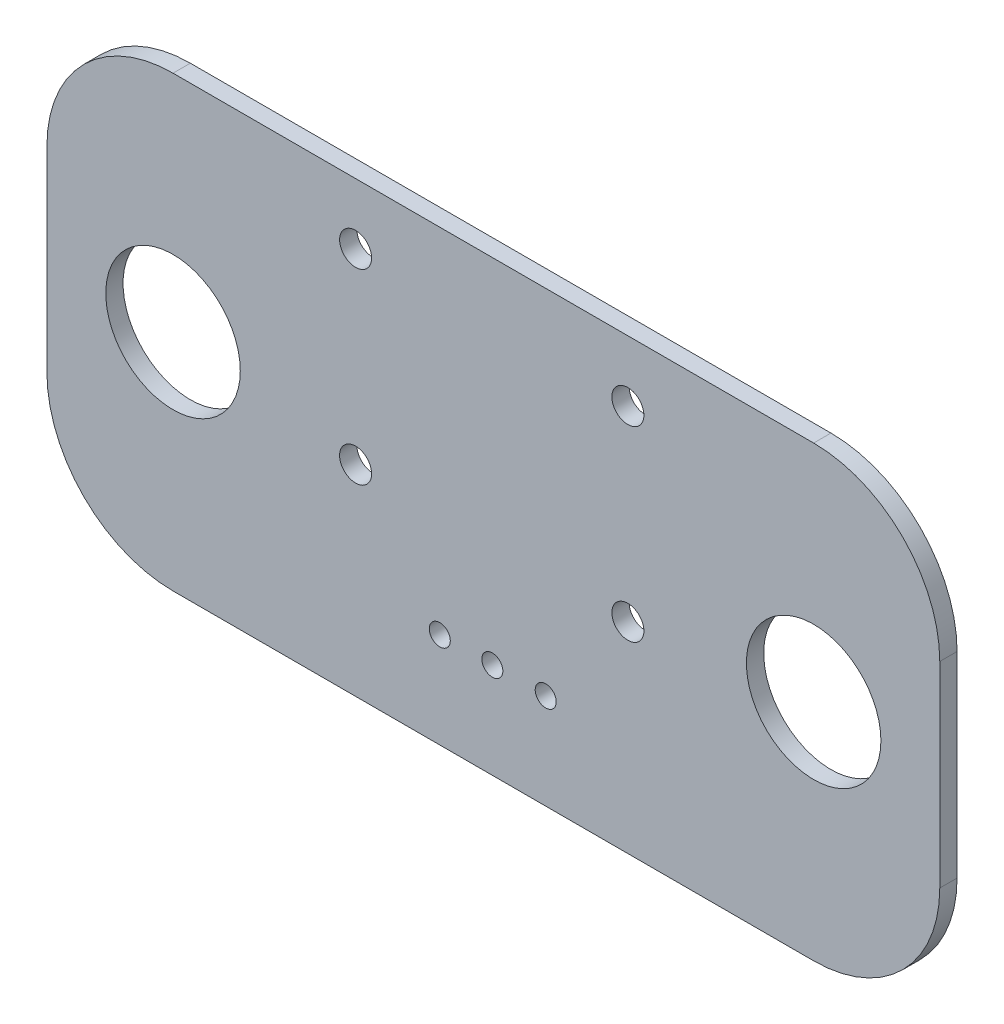
ISO-10303-21;
HEADER;
FILE_DESCRIPTION(('STEP AP214'),'2;1');
FILE_NAME('part.step','',(''),(''),'','','');
FILE_SCHEMA(('AUTOMOTIVE_DESIGN { 1 0 10303 214 1 1 1 1 }'));
ENDSEC;
DATA;
#1=APPLICATION_CONTEXT('core data for automotive mechanical design processes');
#2=APPLICATION_PROTOCOL_DEFINITION('international standard','automotive_design',2000,#1);
#3=PRODUCT_CONTEXT('',#1,'mechanical');
#4=PRODUCT('Part','Part','',(#3));
#5=PRODUCT_RELATED_PRODUCT_CATEGORY('part','',(#4));
#6=PRODUCT_DEFINITION_FORMATION('','',#4);
#7=PRODUCT_DEFINITION_CONTEXT('part definition',#1,'design');
#8=PRODUCT_DEFINITION('design','',#6,#7);
#9=PRODUCT_DEFINITION_SHAPE('','',#8);
#10=(LENGTH_UNIT() NAMED_UNIT(*) SI_UNIT(.MILLI.,.METRE.));
#11=(NAMED_UNIT(*) PLANE_ANGLE_UNIT() SI_UNIT($,.RADIAN.));
#12=(NAMED_UNIT(*) SI_UNIT($,.STERADIAN.) SOLID_ANGLE_UNIT());
#13=UNCERTAINTY_MEASURE_WITH_UNIT(LENGTH_MEASURE(1.E-05),#10,'distance_accuracy_value','');
#14=(GEOMETRIC_REPRESENTATION_CONTEXT(3) GLOBAL_UNCERTAINTY_ASSIGNED_CONTEXT((#13)) GLOBAL_UNIT_ASSIGNED_CONTEXT((#10,
#11,#12)) REPRESENTATION_CONTEXT('',''));
#15=CARTESIAN_POINT('',(0.,0.,0.));
#16=DIRECTION('',(0.,0.,1.));
#17=DIRECTION('',(1.,0.,0.));
#18=AXIS2_PLACEMENT_3D('',#15,#16,#17);
#19=CARTESIAN_POINT('',(37.840912359576,52.332087976117,-0.41148));
#20=DIRECTION('',(0.,0.,-1.));
#21=DIRECTION('',(0.00036210027185349,-0.999999934441694,0.));
#22=AXIS2_PLACEMENT_3D('',#19,#20,#21);
#23=CYLINDRICAL_SURFACE('',#22,3.001086891125);
#24=CARTESIAN_POINT('',(37.840912359576,52.332087976117,-0.41148));
#25=DIRECTION('',(0.,0.,1.));
#26=DIRECTION('',(0.00036210027185349,-0.999999934441694,0.));
#27=AXIS2_PLACEMENT_3D('',#24,#25,#26);
#28=CIRCLE('',#27,3.001086891125);
#29=CARTESIAN_POINT('',(37.841999053955,49.331001281738,-0.41148));
#30=VERTEX_POINT('',#29);
#31=CARTESIAN_POINT('',(40.841999053955,52.331001281738,-0.41148));
#32=VERTEX_POINT('',#31);
#33=EDGE_CURVE('E48',#30,#32,#28,.T.);
#34=ORIENTED_EDGE('',*,*,#33,.T.);
#35=DIRECTION('',(0.,0.,1.));
#36=VECTOR('',#35,1.);
#37=CARTESIAN_POINT('',(40.841999053955,52.331001281738,-0.41148));
#38=LINE('',#37,#36);
#39=CARTESIAN_POINT('',(40.841999053955,52.331001281738,0.));
#40=VERTEX_POINT('',#39);
#41=EDGE_CURVE('E232',#32,#40,#38,.T.);
#42=ORIENTED_EDGE('',*,*,#41,.T.);
#43=CARTESIAN_POINT('',(37.840912359576,52.332087976117,0.));
#44=DIRECTION('',(0.,0.,1.));
#45=DIRECTION('',(0.00036210027185349,-0.999999934441694,0.));
#46=AXIS2_PLACEMENT_3D('',#43,#44,#45);
#47=CIRCLE('',#46,3.001086891125);
#48=CARTESIAN_POINT('',(37.841999053955,49.331001281738,0.));
#49=VERTEX_POINT('',#48);
#50=EDGE_CURVE('E218',#49,#40,#47,.T.);
#51=ORIENTED_EDGE('',*,*,#50,.F.);
#52=DIRECTION('',(0.,0.,1.));
#53=VECTOR('',#52,1.);
#54=CARTESIAN_POINT('',(37.841999053955,49.331001281738,-0.41148));
#55=LINE('',#54,#53);
#56=EDGE_CURVE('E11',#30,#49,#55,.T.);
#57=ORIENTED_EDGE('',*,*,#56,.F.);
#58=EDGE_LOOP('',(#34,#42,#51,#57));
#59=FACE_BOUND('',#58,.T.);
#60=ADVANCED_FACE('F38',(#59),#23,.T.);
#61=CARTESIAN_POINT('',(40.841999053955,52.331001281738,-0.41148));
#62=DIRECTION('',(-1.,0.,0.));
#63=DIRECTION('',(0.,0.,1.));
#64=AXIS2_PLACEMENT_3D('',#61,#62,#63);
#65=PLANE('',#64);
#66=DIRECTION('',(0.,1.,0.));
#67=VECTOR('',#66,1.);
#68=CARTESIAN_POINT('',(40.841999053955,52.331001281738,-0.41148));
#69=LINE('',#68,#67);
#70=CARTESIAN_POINT('',(40.841999053955,56.999000549316,-0.41148));
#71=VERTEX_POINT('',#70);
#72=EDGE_CURVE('E201',#32,#71,#69,.T.);
#73=ORIENTED_EDGE('',*,*,#72,.T.);
#74=DIRECTION('',(0.,0.,1.));
#75=VECTOR('',#74,1.);
#76=CARTESIAN_POINT('',(40.841999053955,56.999000549316,-0.41148));
#77=LINE('',#76,#75);
#78=CARTESIAN_POINT('',(40.841999053955,56.999000549316,0.));
#79=VERTEX_POINT('',#78);
#80=EDGE_CURVE('E198',#71,#79,#77,.T.);
#81=ORIENTED_EDGE('',*,*,#80,.T.);
#82=DIRECTION('',(0.,1.,0.));
#83=VECTOR('',#82,1.);
#84=CARTESIAN_POINT('',(40.841999053955,52.331001281738,0.));
#85=LINE('',#84,#83);
#86=EDGE_CURVE('E215',#40,#79,#85,.T.);
#87=ORIENTED_EDGE('',*,*,#86,.F.);
#88=ORIENTED_EDGE('',*,*,#41,.F.);
#89=EDGE_LOOP('',(#73,#81,#87,#88));
#90=FACE_BOUND('',#89,.T.);
#91=ADVANCED_FACE('F329',(#90),#65,.F.);
#92=CARTESIAN_POINT('',(37.840905841769,56.997907337131,-0.41148));
#93=DIRECTION('',(0.,0.,-1.));
#94=DIRECTION('',(0.999999933653209,0.000364271295750376,0.));
#95=AXIS2_PLACEMENT_3D('',#92,#93,#94);
#96=CYLINDRICAL_SURFACE('',#95,3.001093411299);
#97=CARTESIAN_POINT('',(37.840905841769,56.997907337131,-0.41148));
#98=DIRECTION('',(0.,0.,1.));
#99=DIRECTION('',(0.999999933653209,0.000364271295750376,0.));
#100=AXIS2_PLACEMENT_3D('',#97,#98,#99);
#101=CIRCLE('',#100,3.001093411299);
#102=CARTESIAN_POINT('',(37.841999053955,59.999000549316,-0.41148));
#103=VERTEX_POINT('',#102);
#104=EDGE_CURVE('E202',#71,#103,#101,.T.);
#105=ORIENTED_EDGE('',*,*,#104,.T.);
#106=DIRECTION('',(0.,0.,1.));
#107=VECTOR('',#106,1.);
#108=CARTESIAN_POINT('',(37.841999053955,59.999000549316,-0.41148));
#109=LINE('',#108,#107);
#110=CARTESIAN_POINT('',(37.841999053955,59.999000549316,0.));
#111=VERTEX_POINT('',#110);
#112=EDGE_CURVE('E183',#103,#111,#109,.T.);
#113=ORIENTED_EDGE('',*,*,#112,.T.);
#114=CARTESIAN_POINT('',(37.840905841769,56.997907337131,0.));
#115=DIRECTION('',(0.,0.,1.));
#116=DIRECTION('',(0.999999933653209,0.000364271295750376,0.));
#117=AXIS2_PLACEMENT_3D('',#114,#115,#116);
#118=CIRCLE('',#117,3.001093411299);
#119=EDGE_CURVE('E205',#79,#111,#118,.T.);
#120=ORIENTED_EDGE('',*,*,#119,.F.);
#121=ORIENTED_EDGE('',*,*,#80,.F.);
#122=EDGE_LOOP('',(#105,#113,#120,#121));
#123=FACE_BOUND('',#122,.T.);
#124=ADVANCED_FACE('F335',(#123),#96,.T.);
#125=CARTESIAN_POINT('',(37.841999053955,59.999000549316,-0.41148));
#126=DIRECTION('',(0.,-1.,0.));
#127=DIRECTION('',(0.,0.,-1.));
#128=AXIS2_PLACEMENT_3D('',#125,#126,#127);
#129=PLANE('',#128);
#130=DIRECTION('',(-1.,0.,0.));
#131=VECTOR('',#130,1.);
#132=CARTESIAN_POINT('',(37.841999053955,59.999000549316,-0.41148));
#133=LINE('',#132,#131);
#134=CARTESIAN_POINT('',(22.601999282837,59.999000549316,-0.41148));
#135=VERTEX_POINT('',#134);
#136=EDGE_CURVE('E180',#103,#135,#133,.T.);
#137=ORIENTED_EDGE('',*,*,#136,.T.);
#138=DIRECTION('',(0.,0.,1.));
#139=VECTOR('',#138,1.);
#140=CARTESIAN_POINT('',(22.601999282837,59.999000549316,-0.41148));
#141=LINE('',#140,#139);
#142=CARTESIAN_POINT('',(22.601999282837,59.999000549316,0.));
#143=VERTEX_POINT('',#142);
#144=EDGE_CURVE('E184',#135,#143,#141,.T.);
#145=ORIENTED_EDGE('',*,*,#144,.T.);
#146=DIRECTION('',(-1.,0.,0.));
#147=VECTOR('',#146,1.);
#148=CARTESIAN_POINT('',(37.841999053955,59.999000549316,0.));
#149=LINE('',#148,#147);
#150=EDGE_CURVE('E203',#111,#143,#149,.T.);
#151=ORIENTED_EDGE('',*,*,#150,.F.);
#152=ORIENTED_EDGE('',*,*,#112,.F.);
#153=EDGE_LOOP('',(#137,#145,#151,#152));
#154=FACE_BOUND('',#153,.T.);
#155=ADVANCED_FACE('F369',(#154),#129,.F.);
#156=CARTESIAN_POINT('',(22.601389310775,56.999610151806,-0.41148));
#157=DIRECTION('',(0.,0.,-1.));
#158=DIRECTION('',(0.000203365340446154,0.999999979321269,0.));
#159=AXIS2_PLACEMENT_3D('',#156,#157,#158);
#160=CYLINDRICAL_SURFACE('',#159,2.999390459534);
#161=CARTESIAN_POINT('',(22.601389310775,56.999610151806,-0.41148));
#162=DIRECTION('',(0.,0.,1.));
#163=DIRECTION('',(0.000203365340446154,0.999999979321269,0.));
#164=AXIS2_PLACEMENT_3D('',#161,#162,#163);
#165=CIRCLE('',#164,2.999390459534);
#166=CARTESIAN_POINT('',(19.601999282837,56.998001098633,-0.41148));
#167=VERTEX_POINT('',#166);
#168=EDGE_CURVE('E209',#135,#167,#165,.T.);
#169=ORIENTED_EDGE('',*,*,#168,.T.);
#170=DIRECTION('',(0.,0.,1.));
#171=VECTOR('',#170,1.);
#172=CARTESIAN_POINT('',(19.601999282837,56.998001098633,-0.41148));
#173=LINE('',#172,#171);
#174=CARTESIAN_POINT('',(19.601999282837,56.998001098633,0.));
#175=VERTEX_POINT('',#174);
#176=EDGE_CURVE('E245',#167,#175,#173,.T.);
#177=ORIENTED_EDGE('',*,*,#176,.T.);
#178=CARTESIAN_POINT('',(22.601389310775,56.999610151806,0.));
#179=DIRECTION('',(0.,0.,1.));
#180=DIRECTION('',(0.000203365340446154,0.999999979321269,0.));
#181=AXIS2_PLACEMENT_3D('',#178,#179,#180);
#182=CIRCLE('',#181,2.999390459534);
#183=EDGE_CURVE('E206',#143,#175,#182,.T.);
#184=ORIENTED_EDGE('',*,*,#183,.F.);
#185=ORIENTED_EDGE('',*,*,#144,.F.);
#186=EDGE_LOOP('',(#169,#177,#184,#185));
#187=FACE_BOUND('',#186,.T.);
#188=ADVANCED_FACE('F343',(#187),#160,.T.);
#189=CARTESIAN_POINT('',(19.601999282837,56.998001098633,-0.41148));
#190=DIRECTION('',(1.,0.,0.));
#191=DIRECTION('',(0.,1.,0.));
#192=AXIS2_PLACEMENT_3D('',#189,#190,#191);
#193=PLANE('',#192);
#194=DIRECTION('',(0.,-1.,0.));
#195=VECTOR('',#194,1.);
#196=CARTESIAN_POINT('',(19.601999282837,56.998001098633,-0.41148));
#197=LINE('',#196,#195);
#198=CARTESIAN_POINT('',(19.601999282837,52.331001281738,-0.41148));
#199=VERTEX_POINT('',#198);
#200=EDGE_CURVE('E248',#167,#199,#197,.T.);
#201=ORIENTED_EDGE('',*,*,#200,.T.);
#202=DIRECTION('',(0.,0.,1.));
#203=VECTOR('',#202,1.);
#204=CARTESIAN_POINT('',(19.601999282837,52.331001281738,-0.41148));
#205=LINE('',#204,#203);
#206=CARTESIAN_POINT('',(19.601999282837,52.331001281738,0.));
#207=VERTEX_POINT('',#206);
#208=EDGE_CURVE('E250',#199,#207,#205,.T.);
#209=ORIENTED_EDGE('',*,*,#208,.T.);
#210=DIRECTION('',(0.,-1.,0.));
#211=VECTOR('',#210,1.);
#212=CARTESIAN_POINT('',(19.601999282837,56.998001098633,0.));
#213=LINE('',#212,#211);
#214=EDGE_CURVE('E158',#175,#207,#213,.T.);
#215=ORIENTED_EDGE('',*,*,#214,.F.);
#216=ORIENTED_EDGE('',*,*,#176,.F.);
#217=EDGE_LOOP('',(#201,#209,#215,#216));
#218=FACE_BOUND('',#217,.T.);
#219=ADVANCED_FACE('F341',(#218),#193,.F.);
#220=CARTESIAN_POINT('',(22.601382542079,52.33038454098,-0.41148));
#221=DIRECTION('',(0.,0.,-1.));
#222=DIRECTION('',(-0.999999978859689,0.000205622520230636,0.));
#223=AXIS2_PLACEMENT_3D('',#220,#221,#222);
#224=CYLINDRICAL_SURFACE('',#223,2.99938332265);
#225=DIRECTION('',(0.,0.,1.));
#226=VECTOR('',#225,1.);
#227=CARTESIAN_POINT('',(22.601999282837,49.331001281738,-0.41148));
#228=LINE('',#227,#226);
#229=CARTESIAN_POINT('',(22.601999282837,49.331001281738,-0.41148));
#230=VERTEX_POINT('',#229);
#231=CARTESIAN_POINT('',(22.601999282837,49.331001281738,0.));
#232=VERTEX_POINT('',#231);
#233=EDGE_CURVE('E163',#230,#232,#228,.T.);
#234=ORIENTED_EDGE('',*,*,#233,.T.);
#235=CARTESIAN_POINT('',(22.601382542079,52.33038454098,0.));
#236=DIRECTION('',(0.,0.,1.));
#237=DIRECTION('',(-0.999999978859689,0.000205622520230636,0.));
#238=AXIS2_PLACEMENT_3D('',#235,#236,#237);
#239=CIRCLE('',#238,2.99938332265);
#240=EDGE_CURVE('E152',#207,#232,#239,.T.);
#241=ORIENTED_EDGE('',*,*,#240,.F.);
#242=ORIENTED_EDGE('',*,*,#208,.F.);
#243=CARTESIAN_POINT('',(22.601382542079,52.33038454098,-0.41148));
#244=DIRECTION('',(0.,0.,1.));
#245=DIRECTION('',(-0.999999978859689,0.000205622520230636,0.));
#246=AXIS2_PLACEMENT_3D('',#243,#244,#245);
#247=CIRCLE('',#246,2.99938332265);
#248=EDGE_CURVE('E166',#199,#230,#247,.T.);
#249=ORIENTED_EDGE('',*,*,#248,.T.);
#250=EDGE_LOOP('',(#234,#241,#242,#249));
#251=FACE_BOUND('',#250,.T.);
#252=ADVANCED_FACE('F164',(#251),#224,.T.);
#253=CARTESIAN_POINT('',(22.601999282837,49.331001281738,-0.41148));
#254=DIRECTION('',(0.,1.,0.));
#255=DIRECTION('',(1.,0.,0.));
#256=AXIS2_PLACEMENT_3D('',#253,#254,#255);
#257=PLANE('',#256);
#258=DIRECTION('',(1.,0.,0.));
#259=VECTOR('',#258,1.);
#260=CARTESIAN_POINT('',(22.601999282837,49.331001281738,-0.41148));
#261=LINE('',#260,#259);
#262=EDGE_CURVE('E170',#230,#30,#261,.T.);
#263=ORIENTED_EDGE('',*,*,#262,.T.);
#264=ORIENTED_EDGE('',*,*,#56,.T.);
#265=DIRECTION('',(1.,0.,0.));
#266=VECTOR('',#265,1.);
#267=CARTESIAN_POINT('',(22.601999282837,49.331001281738,0.));
#268=LINE('',#267,#266);
#269=EDGE_CURVE('E57',#232,#49,#268,.T.);
#270=ORIENTED_EDGE('',*,*,#269,.F.);
#271=ORIENTED_EDGE('',*,*,#233,.F.);
#272=EDGE_LOOP('',(#263,#264,#270,#271));
#273=FACE_BOUND('',#272,.T.);
#274=ADVANCED_FACE('F172',(#273),#257,.F.);
#275=CARTESIAN_POINT('',(22.601682,54.665118,-0.41148));
#276=DIRECTION('',(0.,0.,-1.));
#277=DIRECTION('',(1.,0.,0.));
#278=AXIS2_PLACEMENT_3D('',#275,#276,#277);
#279=CYLINDRICAL_SURFACE('',#278,1.59999934);
#280=DIRECTION('',(0.,0.,1.));
#281=VECTOR('',#280,1.);
#282=CARTESIAN_POINT('',(24.20168134,54.665118,-0.41148));
#283=LINE('',#282,#281);
#284=CARTESIAN_POINT('',(24.20168134,54.665118,-0.41148));
#285=VERTEX_POINT('',#284);
#286=CARTESIAN_POINT('',(24.20168134,54.665118,0.));
#287=VERTEX_POINT('',#286);
#288=EDGE_CURVE('E213',#285,#287,#283,.T.);
#289=ORIENTED_EDGE('',*,*,#288,.T.);
#290=CARTESIAN_POINT('',(22.601682,54.665118,0.));
#291=DIRECTION('',(0.,0.,1.));
#292=DIRECTION('',(1.,0.,0.));
#293=AXIS2_PLACEMENT_3D('',#290,#291,#292);
#294=CIRCLE('',#293,1.59999934);
#295=EDGE_CURVE('E210',#287,#287,#294,.T.);
#296=ORIENTED_EDGE('',*,*,#295,.T.);
#297=ORIENTED_EDGE('',*,*,#288,.F.);
#298=CARTESIAN_POINT('',(22.601682,54.665118,-0.41148));
#299=DIRECTION('',(0.,0.,1.));
#300=DIRECTION('',(1.,0.,0.));
#301=AXIS2_PLACEMENT_3D('',#298,#299,#300);
#302=CIRCLE('',#301,1.59999934);
#303=EDGE_CURVE('E241',#285,#285,#302,.T.);
#304=ORIENTED_EDGE('',*,*,#303,.F.);
#305=EDGE_LOOP('',(#289,#296,#297,#304));
#306=FACE_BOUND('',#305,.T.);
#307=ADVANCED_FACE('F304',(#306),#279,.F.);
#308=CARTESIAN_POINT('',(26.945082,54.106318,-0.41148));
#309=DIRECTION('',(0.,0.,-1.));
#310=DIRECTION('',(1.,0.,0.));
#311=AXIS2_PLACEMENT_3D('',#308,#309,#310);
#312=CYLINDRICAL_SURFACE('',#311,0.381);
#313=DIRECTION('',(0.,0.,1.));
#314=VECTOR('',#313,1.);
#315=CARTESIAN_POINT('',(27.326082,54.106318,-0.41148));
#316=LINE('',#315,#314);
#317=CARTESIAN_POINT('',(27.326082,54.106318,-0.41148));
#318=VERTEX_POINT('',#317);
#319=CARTESIAN_POINT('',(27.326082,54.106318,0.));
#320=VERTEX_POINT('',#319);
#321=EDGE_CURVE('E214',#318,#320,#316,.T.);
#322=ORIENTED_EDGE('',*,*,#321,.T.);
#323=CARTESIAN_POINT('',(26.945082,54.106318,0.));
#324=DIRECTION('',(0.,0.,1.));
#325=DIRECTION('',(1.,0.,0.));
#326=AXIS2_PLACEMENT_3D('',#323,#324,#325);
#327=CIRCLE('',#326,0.381);
#328=EDGE_CURVE('E193',#320,#320,#327,.T.);
#329=ORIENTED_EDGE('',*,*,#328,.T.);
#330=ORIENTED_EDGE('',*,*,#321,.F.);
#331=CARTESIAN_POINT('',(26.945082,54.106318,-0.41148));
#332=DIRECTION('',(0.,0.,1.));
#333=DIRECTION('',(1.,0.,0.));
#334=AXIS2_PLACEMENT_3D('',#331,#332,#333);
#335=CIRCLE('',#334,0.381);
#336=EDGE_CURVE('E238',#318,#318,#335,.T.);
#337=ORIENTED_EDGE('',*,*,#336,.F.);
#338=EDGE_LOOP('',(#322,#329,#330,#337));
#339=FACE_BOUND('',#338,.T.);
#340=ADVANCED_FACE('F40',(#339),#312,.F.);
#341=CARTESIAN_POINT('',(26.945082,58.551318,-0.41148));
#342=DIRECTION('',(0.,0.,-1.));
#343=DIRECTION('',(1.,0.,0.));
#344=AXIS2_PLACEMENT_3D('',#341,#342,#343);
#345=CYLINDRICAL_SURFACE('',#344,0.381);
#346=DIRECTION('',(0.,0.,1.));
#347=VECTOR('',#346,1.);
#348=CARTESIAN_POINT('',(27.326082,58.551318,-0.41148));
#349=LINE('',#348,#347);
#350=CARTESIAN_POINT('',(27.326082,58.551318,-0.41148));
#351=VERTEX_POINT('',#350);
#352=CARTESIAN_POINT('',(27.326082,58.551318,0.));
#353=VERTEX_POINT('',#352);
#354=EDGE_CURVE('E190',#351,#353,#349,.T.);
#355=ORIENTED_EDGE('',*,*,#354,.T.);
#356=CARTESIAN_POINT('',(26.945082,58.551318,0.));
#357=DIRECTION('',(0.,0.,1.));
#358=DIRECTION('',(1.,0.,0.));
#359=AXIS2_PLACEMENT_3D('',#356,#357,#358);
#360=CIRCLE('',#359,0.381);
#361=EDGE_CURVE('E194',#353,#353,#360,.T.);
#362=ORIENTED_EDGE('',*,*,#361,.T.);
#363=ORIENTED_EDGE('',*,*,#354,.F.);
#364=CARTESIAN_POINT('',(26.945082,58.551318,-0.41148));
#365=DIRECTION('',(0.,0.,1.));
#366=DIRECTION('',(1.,0.,0.));
#367=AXIS2_PLACEMENT_3D('',#364,#365,#366);
#368=CIRCLE('',#367,0.381);
#369=EDGE_CURVE('E242',#351,#351,#368,.T.);
#370=ORIENTED_EDGE('',*,*,#369,.F.);
#371=EDGE_LOOP('',(#355,#362,#363,#370));
#372=FACE_BOUND('',#371,.T.);
#373=ADVANCED_FACE('F358',(#372),#345,.F.);
#374=CARTESIAN_POINT('',(28.94767896,51.6027416,-0.41148));
#375=DIRECTION('',(0.,0.,-1.));
#376=DIRECTION('',(1.,0.,0.));
#377=AXIS2_PLACEMENT_3D('',#374,#375,#376);
#378=CYLINDRICAL_SURFACE('',#377,0.2499995);
#379=DIRECTION('',(0.,0.,1.));
#380=VECTOR('',#379,1.);
#381=CARTESIAN_POINT('',(29.19767846,51.6027416,-0.41148));
#382=LINE('',#381,#380);
#383=CARTESIAN_POINT('',(29.19767846,51.6027416,-0.41148));
#384=VERTEX_POINT('',#383);
#385=CARTESIAN_POINT('',(29.19767846,51.6027416,0.));
#386=VERTEX_POINT('',#385);
#387=EDGE_CURVE('E225',#384,#386,#382,.T.);
#388=ORIENTED_EDGE('',*,*,#387,.T.);
#389=CARTESIAN_POINT('',(28.94767896,51.6027416,0.));
#390=DIRECTION('',(0.,0.,1.));
#391=DIRECTION('',(1.,0.,0.));
#392=AXIS2_PLACEMENT_3D('',#389,#390,#391);
#393=CIRCLE('',#392,0.2499995);
#394=EDGE_CURVE('E228',#386,#386,#393,.T.);
#395=ORIENTED_EDGE('',*,*,#394,.T.);
#396=ORIENTED_EDGE('',*,*,#387,.F.);
#397=CARTESIAN_POINT('',(28.94767896,51.6027416,-0.41148));
#398=DIRECTION('',(0.,0.,1.));
#399=DIRECTION('',(1.,0.,0.));
#400=AXIS2_PLACEMENT_3D('',#397,#398,#399);
#401=CIRCLE('',#400,0.2499995);
#402=EDGE_CURVE('E237',#384,#384,#401,.T.);
#403=ORIENTED_EDGE('',*,*,#402,.F.);
#404=EDGE_LOOP('',(#388,#395,#396,#403));
#405=FACE_BOUND('',#404,.T.);
#406=ADVANCED_FACE('F354',(#405),#378,.F.);
#407=CARTESIAN_POINT('',(30.197679,51.6027416,-0.41148));
#408=DIRECTION('',(0.,0.,-1.));
#409=DIRECTION('',(1.,0.,0.));
#410=AXIS2_PLACEMENT_3D('',#407,#408,#409);
#411=CYLINDRICAL_SURFACE('',#410,0.2499995);
#412=DIRECTION('',(0.,0.,1.));
#413=VECTOR('',#412,1.);
#414=CARTESIAN_POINT('',(30.4476785,51.6027416,-0.41148));
#415=LINE('',#414,#413);
#416=CARTESIAN_POINT('',(30.4476785,51.6027416,-0.41148));
#417=VERTEX_POINT('',#416);
#418=CARTESIAN_POINT('',(30.4476785,51.6027416,0.));
#419=VERTEX_POINT('',#418);
#420=EDGE_CURVE('E251',#417,#419,#415,.T.);
#421=ORIENTED_EDGE('',*,*,#420,.T.);
#422=CARTESIAN_POINT('',(30.197679,51.6027416,0.));
#423=DIRECTION('',(0.,0.,1.));
#424=DIRECTION('',(1.,0.,0.));
#425=AXIS2_PLACEMENT_3D('',#422,#423,#424);
#426=CIRCLE('',#425,0.2499995);
#427=EDGE_CURVE('E114',#419,#419,#426,.T.);
#428=ORIENTED_EDGE('',*,*,#427,.T.);
#429=ORIENTED_EDGE('',*,*,#420,.F.);
#430=CARTESIAN_POINT('',(30.197679,51.6027416,-0.41148));
#431=DIRECTION('',(0.,0.,1.));
#432=DIRECTION('',(1.,0.,0.));
#433=AXIS2_PLACEMENT_3D('',#430,#431,#432);
#434=CIRCLE('',#433,0.2499995);
#435=EDGE_CURVE('E122',#417,#417,#434,.T.);
#436=ORIENTED_EDGE('',*,*,#435,.F.);
#437=EDGE_LOOP('',(#421,#428,#429,#436));
#438=FACE_BOUND('',#437,.T.);
#439=ADVANCED_FACE('F357',(#438),#411,.F.);
#440=CARTESIAN_POINT('',(31.467679,51.6027416,-0.41148));
#441=DIRECTION('',(0.,0.,-1.));
#442=DIRECTION('',(1.,0.,0.));
#443=AXIS2_PLACEMENT_3D('',#440,#441,#442);
#444=CYLINDRICAL_SURFACE('',#443,0.2499995);
#445=DIRECTION('',(0.,0.,1.));
#446=VECTOR('',#445,1.);
#447=CARTESIAN_POINT('',(31.7176785,51.6027416,-0.41148));
#448=LINE('',#447,#446);
#449=CARTESIAN_POINT('',(31.7176785,51.6027416,-0.41148));
#450=VERTEX_POINT('',#449);
#451=CARTESIAN_POINT('',(31.7176785,51.6027416,0.));
#452=VERTEX_POINT('',#451);
#453=EDGE_CURVE('E233',#450,#452,#448,.T.);
#454=ORIENTED_EDGE('',*,*,#453,.T.);
#455=CARTESIAN_POINT('',(31.467679,51.6027416,0.));
#456=DIRECTION('',(0.,0.,1.));
#457=DIRECTION('',(1.,0.,0.));
#458=AXIS2_PLACEMENT_3D('',#455,#456,#457);
#459=CIRCLE('',#458,0.2499995);
#460=EDGE_CURVE('E42',#452,#452,#459,.T.);
#461=ORIENTED_EDGE('',*,*,#460,.T.);
#462=ORIENTED_EDGE('',*,*,#453,.F.);
#463=CARTESIAN_POINT('',(31.467679,51.6027416,-0.41148));
#464=DIRECTION('',(0.,0.,1.));
#465=DIRECTION('',(1.,0.,0.));
#466=AXIS2_PLACEMENT_3D('',#463,#464,#465);
#467=CIRCLE('',#466,0.2499995);
#468=EDGE_CURVE('E178',#450,#450,#467,.T.);
#469=ORIENTED_EDGE('',*,*,#468,.F.);
#470=EDGE_LOOP('',(#454,#461,#462,#469));
#471=FACE_BOUND('',#470,.T.);
#472=ADVANCED_FACE('F360',(#471),#444,.F.);
#473=CARTESIAN_POINT('',(33.422082,58.551318,-0.41148));
#474=DIRECTION('',(0.,0.,-1.));
#475=DIRECTION('',(1.,0.,0.));
#476=AXIS2_PLACEMENT_3D('',#473,#474,#475);
#477=CYLINDRICAL_SURFACE('',#476,0.381);
#478=DIRECTION('',(0.,0.,1.));
#479=VECTOR('',#478,1.);
#480=CARTESIAN_POINT('',(33.803082,58.551318,-0.41148));
#481=LINE('',#480,#479);
#482=CARTESIAN_POINT('',(33.803082,58.551318,-0.41148));
#483=VERTEX_POINT('',#482);
#484=CARTESIAN_POINT('',(33.803082,58.551318,0.));
#485=VERTEX_POINT('',#484);
#486=EDGE_CURVE('E222',#483,#485,#481,.T.);
#487=ORIENTED_EDGE('',*,*,#486,.T.);
#488=CARTESIAN_POINT('',(33.422082,58.551318,0.));
#489=DIRECTION('',(0.,0.,1.));
#490=DIRECTION('',(1.,0.,0.));
#491=AXIS2_PLACEMENT_3D('',#488,#489,#490);
#492=CIRCLE('',#491,0.381);
#493=EDGE_CURVE('E219',#485,#485,#492,.T.);
#494=ORIENTED_EDGE('',*,*,#493,.T.);
#495=ORIENTED_EDGE('',*,*,#486,.F.);
#496=CARTESIAN_POINT('',(33.422082,58.551318,-0.41148));
#497=DIRECTION('',(0.,0.,1.));
#498=DIRECTION('',(1.,0.,0.));
#499=AXIS2_PLACEMENT_3D('',#496,#497,#498);
#500=CIRCLE('',#499,0.381);
#501=EDGE_CURVE('E280',#483,#483,#500,.T.);
#502=ORIENTED_EDGE('',*,*,#501,.F.);
#503=EDGE_LOOP('',(#487,#494,#495,#502));
#504=FACE_BOUND('',#503,.T.);
#505=ADVANCED_FACE('F340',(#504),#477,.F.);
#506=CARTESIAN_POINT('',(33.422082,54.106318,-0.41148));
#507=DIRECTION('',(0.,0.,-1.));
#508=DIRECTION('',(1.,0.,0.));
#509=AXIS2_PLACEMENT_3D('',#506,#507,#508);
#510=CYLINDRICAL_SURFACE('',#509,0.381);
#511=DIRECTION('',(0.,0.,1.));
#512=VECTOR('',#511,1.);
#513=CARTESIAN_POINT('',(33.803082,54.106318,-0.41148));
#514=LINE('',#513,#512);
#515=CARTESIAN_POINT('',(33.803082,54.106318,-0.41148));
#516=VERTEX_POINT('',#515);
#517=CARTESIAN_POINT('',(33.803082,54.106318,0.));
#518=VERTEX_POINT('',#517);
#519=EDGE_CURVE('E188',#516,#518,#514,.T.);
#520=ORIENTED_EDGE('',*,*,#519,.T.);
#521=CARTESIAN_POINT('',(33.422082,54.106318,0.));
#522=DIRECTION('',(0.,0.,1.));
#523=DIRECTION('',(1.,0.,0.));
#524=AXIS2_PLACEMENT_3D('',#521,#522,#523);
#525=CIRCLE('',#524,0.381);
#526=EDGE_CURVE('E185',#518,#518,#525,.T.);
#527=ORIENTED_EDGE('',*,*,#526,.T.);
#528=ORIENTED_EDGE('',*,*,#519,.F.);
#529=CARTESIAN_POINT('',(33.422082,54.106318,-0.41148));
#530=DIRECTION('',(0.,0.,1.));
#531=DIRECTION('',(1.,0.,0.));
#532=AXIS2_PLACEMENT_3D('',#529,#530,#531);
#533=CIRCLE('',#532,0.381);
#534=EDGE_CURVE('E272',#516,#516,#533,.T.);
#535=ORIENTED_EDGE('',*,*,#534,.F.);
#536=EDGE_LOOP('',(#520,#527,#528,#535));
#537=FACE_BOUND('',#536,.T.);
#538=ADVANCED_FACE('F325',(#537),#510,.F.);
#539=CARTESIAN_POINT('',(37.841682,54.665118,-0.41148));
#540=DIRECTION('',(0.,0.,-1.));
#541=DIRECTION('',(1.,0.,0.));
#542=AXIS2_PLACEMENT_3D('',#539,#540,#541);
#543=CYLINDRICAL_SURFACE('',#542,1.59999934);
#544=DIRECTION('',(0.,0.,1.));
#545=VECTOR('',#544,1.);
#546=CARTESIAN_POINT('',(39.44168134,54.665118,-0.41148));
#547=LINE('',#546,#545);
#548=CARTESIAN_POINT('',(39.44168134,54.665118,-0.41148));
#549=VERTEX_POINT('',#548);
#550=CARTESIAN_POINT('',(39.44168134,54.665118,0.));
#551=VERTEX_POINT('',#550);
#552=EDGE_CURVE('E189',#549,#551,#547,.T.);
#553=ORIENTED_EDGE('',*,*,#552,.T.);
#554=CARTESIAN_POINT('',(37.841682,54.665118,0.));
#555=DIRECTION('',(0.,0.,1.));
#556=DIRECTION('',(1.,0.,0.));
#557=AXIS2_PLACEMENT_3D('',#554,#555,#556);
#558=CIRCLE('',#557,1.59999934);
#559=EDGE_CURVE('E197',#551,#551,#558,.T.);
#560=ORIENTED_EDGE('',*,*,#559,.T.);
#561=ORIENTED_EDGE('',*,*,#552,.F.);
#562=CARTESIAN_POINT('',(37.841682,54.665118,-0.41148));
#563=DIRECTION('',(0.,0.,1.));
#564=DIRECTION('',(1.,0.,0.));
#565=AXIS2_PLACEMENT_3D('',#562,#563,#564);
#566=CIRCLE('',#565,1.59999934);
#567=EDGE_CURVE('E258',#549,#549,#566,.T.);
#568=ORIENTED_EDGE('',*,*,#567,.F.);
#569=EDGE_LOOP('',(#553,#560,#561,#568));
#570=FACE_BOUND('',#569,.T.);
#571=ADVANCED_FACE('F317',(#570),#543,.F.);
#572=CARTESIAN_POINT('',(4.842000007629,3.006000041962,-0.41148));
#573=DIRECTION('',(0.,0.,-1.));
#574=DIRECTION('',(0.,-1.,0.));
#575=AXIS2_PLACEMENT_3D('',#572,#573,#574);
#576=PLANE('',#575);
#577=ORIENTED_EDGE('',*,*,#33,.F.);
#578=ORIENTED_EDGE('',*,*,#262,.F.);
#579=ORIENTED_EDGE('',*,*,#248,.F.);
#580=ORIENTED_EDGE('',*,*,#200,.F.);
#581=ORIENTED_EDGE('',*,*,#168,.F.);
#582=ORIENTED_EDGE('',*,*,#136,.F.);
#583=ORIENTED_EDGE('',*,*,#104,.F.);
#584=ORIENTED_EDGE('',*,*,#72,.F.);
#585=EDGE_LOOP('',(#577,#578,#579,#580,#581,#582,#583,#584));
#586=FACE_BOUND('',#585,.T.);
#587=ORIENTED_EDGE('',*,*,#303,.T.);
#588=EDGE_LOOP('',(#587));
#589=FACE_BOUND('',#588,.T.);
#590=ORIENTED_EDGE('',*,*,#336,.T.);
#591=EDGE_LOOP('',(#590));
#592=FACE_BOUND('',#591,.T.);
#593=ORIENTED_EDGE('',*,*,#369,.T.);
#594=EDGE_LOOP('',(#593));
#595=FACE_BOUND('',#594,.T.);
#596=ORIENTED_EDGE('',*,*,#402,.T.);
#597=EDGE_LOOP('',(#596));
#598=FACE_BOUND('',#597,.T.);
#599=ORIENTED_EDGE('',*,*,#435,.T.);
#600=EDGE_LOOP('',(#599));
#601=FACE_BOUND('',#600,.T.);
#602=ORIENTED_EDGE('',*,*,#468,.T.);
#603=EDGE_LOOP('',(#602));
#604=FACE_BOUND('',#603,.T.);
#605=ORIENTED_EDGE('',*,*,#501,.T.);
#606=EDGE_LOOP('',(#605));
#607=FACE_BOUND('',#606,.T.);
#608=ORIENTED_EDGE('',*,*,#534,.T.);
#609=EDGE_LOOP('',(#608));
#610=FACE_BOUND('',#609,.T.);
#611=ORIENTED_EDGE('',*,*,#567,.T.);
#612=EDGE_LOOP('',(#611));
#613=FACE_BOUND('',#612,.T.);
#614=ADVANCED_FACE('F300',(#586,#589,#592,#595,#598,#601,#604,#607,#610,#613),#576,.T.);
#615=CARTESIAN_POINT('',(4.842000007629,3.006000041962,0.));
#616=DIRECTION('',(0.,0.,-1.));
#617=DIRECTION('',(0.,-1.,0.));
#618=AXIS2_PLACEMENT_3D('',#615,#616,#617);
#619=PLANE('',#618);
#620=ORIENTED_EDGE('',*,*,#269,.T.);
#621=ORIENTED_EDGE('',*,*,#50,.T.);
#622=ORIENTED_EDGE('',*,*,#86,.T.);
#623=ORIENTED_EDGE('',*,*,#119,.T.);
#624=ORIENTED_EDGE('',*,*,#150,.T.);
#625=ORIENTED_EDGE('',*,*,#183,.T.);
#626=ORIENTED_EDGE('',*,*,#214,.T.);
#627=ORIENTED_EDGE('',*,*,#240,.T.);
#628=EDGE_LOOP('',(#620,#621,#622,#623,#624,#625,#626,#627));
#629=FACE_BOUND('',#628,.T.);
#630=ORIENTED_EDGE('',*,*,#295,.F.);
#631=EDGE_LOOP('',(#630));
#632=FACE_BOUND('',#631,.T.);
#633=ORIENTED_EDGE('',*,*,#328,.F.);
#634=EDGE_LOOP('',(#633));
#635=FACE_BOUND('',#634,.T.);
#636=ORIENTED_EDGE('',*,*,#361,.F.);
#637=EDGE_LOOP('',(#636));
#638=FACE_BOUND('',#637,.T.);
#639=ORIENTED_EDGE('',*,*,#394,.F.);
#640=EDGE_LOOP('',(#639));
#641=FACE_BOUND('',#640,.T.);
#642=ORIENTED_EDGE('',*,*,#427,.F.);
#643=EDGE_LOOP('',(#642));
#644=FACE_BOUND('',#643,.T.);
#645=ORIENTED_EDGE('',*,*,#460,.F.);
#646=EDGE_LOOP('',(#645));
#647=FACE_BOUND('',#646,.T.);
#648=ORIENTED_EDGE('',*,*,#493,.F.);
#649=EDGE_LOOP('',(#648));
#650=FACE_BOUND('',#649,.T.);
#651=ORIENTED_EDGE('',*,*,#526,.F.);
#652=EDGE_LOOP('',(#651));
#653=FACE_BOUND('',#652,.T.);
#654=ORIENTED_EDGE('',*,*,#559,.F.);
#655=EDGE_LOOP('',(#654));
#656=FACE_BOUND('',#655,.T.);
#657=ADVANCED_FACE('F154',(#629,#632,#635,#638,#641,#644,#647,#650,#653,#656),#619,.F.);
#658=CLOSED_SHELL('',(#60,#91,#124,#155,#188,#219,#252,#274,#307,#340,#373,#406,#439,#472,#505,
#538,#571,#614,#657));
#659=MANIFOLD_SOLID_BREP('B2',#658);
#660=ADVANCED_BREP_SHAPE_REPRESENTATION('',(#18,#659),#14);
#661=SHAPE_DEFINITION_REPRESENTATION(#9,#660);
ENDSEC;
END-ISO-10303-21;
